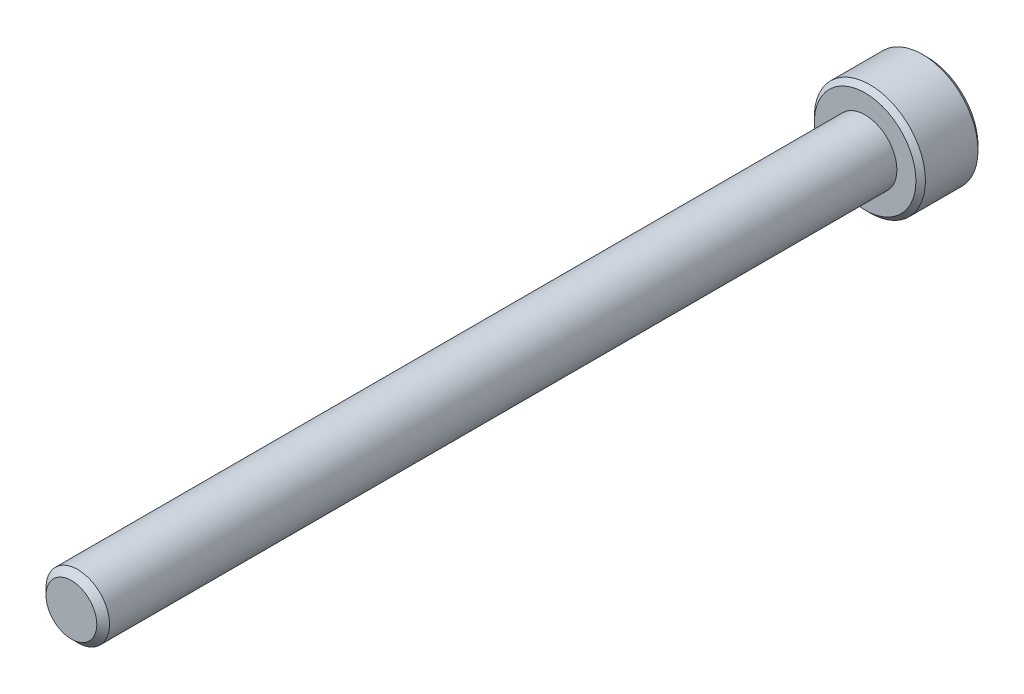
ISO-10303-21;
HEADER;
FILE_DESCRIPTION(('STEP AP214'),'2;1');
FILE_NAME('part.step','',(''),(''),'','','');
FILE_SCHEMA(('AUTOMOTIVE_DESIGN { 1 0 10303 214 1 1 1 1 }'));
ENDSEC;
DATA;
#1=APPLICATION_CONTEXT('core data for automotive mechanical design processes');
#2=APPLICATION_PROTOCOL_DEFINITION('international standard','automotive_design',2000,#1);
#3=PRODUCT_CONTEXT('',#1,'mechanical');
#4=PRODUCT('Part','Part','',(#3));
#5=PRODUCT_RELATED_PRODUCT_CATEGORY('part','',(#4));
#6=PRODUCT_DEFINITION_FORMATION('','',#4);
#7=PRODUCT_DEFINITION_CONTEXT('part definition',#1,'design');
#8=PRODUCT_DEFINITION('design','',#6,#7);
#9=PRODUCT_DEFINITION_SHAPE('','',#8);
#10=(LENGTH_UNIT() NAMED_UNIT(*) SI_UNIT(.MILLI.,.METRE.));
#11=(NAMED_UNIT(*) PLANE_ANGLE_UNIT() SI_UNIT($,.RADIAN.));
#12=(NAMED_UNIT(*) SI_UNIT($,.STERADIAN.) SOLID_ANGLE_UNIT());
#13=UNCERTAINTY_MEASURE_WITH_UNIT(LENGTH_MEASURE(1.E-05),#10,'distance_accuracy_value','');
#14=(GEOMETRIC_REPRESENTATION_CONTEXT(3) GLOBAL_UNCERTAINTY_ASSIGNED_CONTEXT((#13)) GLOBAL_UNIT_ASSIGNED_CONTEXT((#10,
#11,#12)) REPRESENTATION_CONTEXT('',''));
#15=CARTESIAN_POINT('',(0.,0.,0.));
#16=DIRECTION('',(0.,0.,1.));
#17=DIRECTION('',(1.,0.,0.));
#18=AXIS2_PLACEMENT_3D('',#15,#16,#17);
#19=CARTESIAN_POINT('',(0.,0.,3.91));
#20=DIRECTION('',(0.,0.,-1.));
#21=DIRECTION('',(-1.,0.,0.));
#22=AXIS2_PLACEMENT_3D('',#19,#20,#21);
#23=CYLINDRICAL_SURFACE('',#22,3.5);
#24=CARTESIAN_POINT('',(0.,0.,3.61000000000001));
#25=DIRECTION('',(0.,0.,1.));
#26=DIRECTION('',(1.,0.,0.));
#27=AXIS2_PLACEMENT_3D('',#24,#25,#26);
#28=CIRCLE('',#27,3.5);
#29=CARTESIAN_POINT('',(3.5,0.,3.61000000000001));
#30=VERTEX_POINT('',#29);
#31=EDGE_CURVE('E46',#30,#30,#28,.F.);
#32=ORIENTED_EDGE('',*,*,#31,.T.);
#33=EDGE_LOOP('',(#32));
#34=FACE_BOUND('',#33,.T.);
#35=CARTESIAN_POINT('',(0.,0.,0.299999999999994));
#36=DIRECTION('',(0.,0.,1.));
#37=DIRECTION('',(1.,0.,0.));
#38=AXIS2_PLACEMENT_3D('',#35,#36,#37);
#39=CIRCLE('',#38,3.5);
#40=CARTESIAN_POINT('',(3.5,0.,0.299999999999994));
#41=VERTEX_POINT('',#40);
#42=EDGE_CURVE('E157',#41,#41,#39,.T.);
#43=ORIENTED_EDGE('',*,*,#42,.T.);
#44=EDGE_LOOP('',(#43));
#45=FACE_BOUND('',#44,.T.);
#46=ADVANCED_FACE('F37',(#34,#45),#23,.T.);
#47=CARTESIAN_POINT('',(0.,0.,3.91));
#48=DIRECTION('',(0.,0.,1.));
#49=DIRECTION('',(1.,0.,0.));
#50=AXIS2_PLACEMENT_3D('',#47,#48,#49);
#51=PLANE('',#50);
#52=CARTESIAN_POINT('',(0.,0.,3.91));
#53=DIRECTION('',(0.,0.,1.));
#54=DIRECTION('',(1.,0.,0.));
#55=AXIS2_PLACEMENT_3D('',#52,#53,#54);
#56=CIRCLE('',#55,3.20000000000001);
#57=CARTESIAN_POINT('',(3.20000000000001,0.,3.91));
#58=VERTEX_POINT('',#57);
#59=EDGE_CURVE('E154',#58,#58,#56,.T.);
#60=ORIENTED_EDGE('',*,*,#59,.T.);
#61=EDGE_LOOP('',(#60));
#62=FACE_BOUND('',#61,.T.);
#63=CARTESIAN_POINT('',(0.,0.,3.91));
#64=DIRECTION('',(0.,0.,1.));
#65=DIRECTION('',(1.,0.,0.));
#66=AXIS2_PLACEMENT_3D('',#63,#64,#65);
#67=CIRCLE('',#66,2.);
#68=CARTESIAN_POINT('',(2.,0.,3.91));
#69=VERTEX_POINT('',#68);
#70=EDGE_CURVE('E140',#69,#69,#67,.T.);
#71=ORIENTED_EDGE('',*,*,#70,.F.);
#72=EDGE_LOOP('',(#71));
#73=FACE_BOUND('',#72,.T.);
#74=ADVANCED_FACE('F170',(#62,#73),#51,.T.);
#75=CARTESIAN_POINT('',(0.,0.,0.));
#76=DIRECTION('',(0.,0.,1.));
#77=DIRECTION('',(1.,0.,0.));
#78=AXIS2_PLACEMENT_3D('',#75,#76,#77);
#79=PLANE('',#78);
#80=CARTESIAN_POINT('',(0.,0.,0.));
#81=DIRECTION('',(0.,0.,1.));
#82=DIRECTION('',(1.,0.,0.));
#83=AXIS2_PLACEMENT_3D('',#80,#81,#82);
#84=CIRCLE('',#83,3.20000000000002);
#85=CARTESIAN_POINT('',(3.20000000000002,0.,0.));
#86=VERTEX_POINT('',#85);
#87=EDGE_CURVE('E11',#86,#86,#84,.F.);
#88=ORIENTED_EDGE('',*,*,#87,.T.);
#89=EDGE_LOOP('',(#88));
#90=FACE_BOUND('',#89,.T.);
#91=DIRECTION('',(0.866025403784439,-0.5,0.));
#92=VECTOR('',#91,1.);
#93=CARTESIAN_POINT('',(0.,1.76091832102836,0.));
#94=LINE('',#93,#92);
#95=CARTESIAN_POINT('',(0.,1.76091832102836,0.));
#96=VERTEX_POINT('',#95);
#97=CARTESIAN_POINT('',(1.525,0.88045916051418,0.));
#98=VERTEX_POINT('',#97);
#99=EDGE_CURVE('E127',#96,#98,#94,.T.);
#100=ORIENTED_EDGE('',*,*,#99,.F.);
#101=DIRECTION('',(0.866025403784439,0.5,0.));
#102=VECTOR('',#101,1.);
#103=CARTESIAN_POINT('',(-1.525,0.880459160514179,0.));
#104=LINE('',#103,#102);
#105=CARTESIAN_POINT('',(-1.525,0.880459160514179,0.));
#106=VERTEX_POINT('',#105);
#107=EDGE_CURVE('E53',#106,#96,#104,.T.);
#108=ORIENTED_EDGE('',*,*,#107,.F.);
#109=DIRECTION('',(0.,1.,0.));
#110=VECTOR('',#109,1.);
#111=CARTESIAN_POINT('',(-1.525,-0.88045916051418,0.));
#112=LINE('',#111,#110);
#113=CARTESIAN_POINT('',(-1.525,-0.88045916051418,0.));
#114=VERTEX_POINT('',#113);
#115=EDGE_CURVE('E136',#114,#106,#112,.T.);
#116=ORIENTED_EDGE('',*,*,#115,.F.);
#117=DIRECTION('',(-0.866025403784439,0.5,0.));
#118=VECTOR('',#117,1.);
#119=CARTESIAN_POINT('',(0.,-1.76091832102836,0.));
#120=LINE('',#119,#118);
#121=CARTESIAN_POINT('',(0.,-1.76091832102836,0.));
#122=VERTEX_POINT('',#121);
#123=EDGE_CURVE('E134',#122,#114,#120,.T.);
#124=ORIENTED_EDGE('',*,*,#123,.F.);
#125=DIRECTION('',(-0.866025403784438,-0.5,0.));
#126=VECTOR('',#125,1.);
#127=CARTESIAN_POINT('',(1.525,-0.880459160514179,0.));
#128=LINE('',#127,#126);
#129=CARTESIAN_POINT('',(1.525,-0.880459160514179,0.));
#130=VERTEX_POINT('',#129);
#131=EDGE_CURVE('E101',#130,#122,#128,.T.);
#132=ORIENTED_EDGE('',*,*,#131,.F.);
#133=DIRECTION('',(0.,-1.,0.));
#134=VECTOR('',#133,1.);
#135=CARTESIAN_POINT('',(1.525,0.88045916051418,0.));
#136=LINE('',#135,#134);
#137=EDGE_CURVE('E130',#98,#130,#136,.T.);
#138=ORIENTED_EDGE('',*,*,#137,.F.);
#139=EDGE_LOOP('',(#100,#108,#116,#124,#132,#138));
#140=FACE_BOUND('',#139,.T.);
#141=ADVANCED_FACE('F173',(#90,#140),#79,.F.);
#142=CARTESIAN_POINT('',(0.,0.,53.91));
#143=DIRECTION('',(0.,0.,-1.));
#144=DIRECTION('',(-1.,0.,0.));
#145=AXIS2_PLACEMENT_3D('',#142,#143,#144);
#146=CYLINDRICAL_SURFACE('',#145,2.);
#147=CARTESIAN_POINT('',(0.,0.,53.51));
#148=DIRECTION('',(0.,0.,1.));
#149=DIRECTION('',(1.,0.,0.));
#150=AXIS2_PLACEMENT_3D('',#147,#148,#149);
#151=CIRCLE('',#150,2.);
#152=CARTESIAN_POINT('',(2.,0.,53.51));
#153=VERTEX_POINT('',#152);
#154=EDGE_CURVE('E151',#153,#153,#151,.F.);
#155=ORIENTED_EDGE('',*,*,#154,.T.);
#156=EDGE_LOOP('',(#155));
#157=FACE_BOUND('',#156,.T.);
#158=ORIENTED_EDGE('',*,*,#70,.T.);
#159=EDGE_LOOP('',(#158));
#160=FACE_BOUND('',#159,.T.);
#161=ADVANCED_FACE('F177',(#157,#160),#146,.T.);
#162=CARTESIAN_POINT('',(0.,0.,53.91));
#163=DIRECTION('',(0.,0.,1.));
#164=DIRECTION('',(1.,0.,0.));
#165=AXIS2_PLACEMENT_3D('',#162,#163,#164);
#166=PLANE('',#165);
#167=CARTESIAN_POINT('',(0.,0.,53.91));
#168=DIRECTION('',(0.,0.,1.));
#169=DIRECTION('',(1.,0.,0.));
#170=AXIS2_PLACEMENT_3D('',#167,#168,#169);
#171=CIRCLE('',#170,1.6);
#172=CARTESIAN_POINT('',(1.6,0.,53.91));
#173=VERTEX_POINT('',#172);
#174=EDGE_CURVE('E148',#173,#173,#171,.T.);
#175=ORIENTED_EDGE('',*,*,#174,.T.);
#176=EDGE_LOOP('',(#175));
#177=FACE_BOUND('',#176,.T.);
#178=ADVANCED_FACE('F179',(#177),#166,.T.);
#179=CARTESIAN_POINT('',(-1.525,0.880459160514179,2.));
#180=DIRECTION('',(-0.5,0.866025403784439,0.));
#181=DIRECTION('',(-0.866025403784439,-0.5,0.));
#182=AXIS2_PLACEMENT_3D('',#179,#180,#181);
#183=PLANE('',#182);
#184=ORIENTED_EDGE('',*,*,#107,.T.);
#185=DIRECTION('',(0.,0.,-1.));
#186=VECTOR('',#185,1.);
#187=CARTESIAN_POINT('',(0.,1.76091832102836,2.));
#188=LINE('',#187,#186);
#189=CARTESIAN_POINT('',(0.,1.76091832102836,2.));
#190=VERTEX_POINT('',#189);
#191=EDGE_CURVE('E83',#190,#96,#188,.T.);
#192=ORIENTED_EDGE('',*,*,#191,.F.);
#193=DIRECTION('',(0.866025403784439,0.5,0.));
#194=VECTOR('',#193,1.);
#195=CARTESIAN_POINT('',(-1.525,0.880459160514179,2.));
#196=LINE('',#195,#194);
#197=CARTESIAN_POINT('',(-1.525,0.880459160514179,2.));
#198=VERTEX_POINT('',#197);
#199=EDGE_CURVE('E138',#198,#190,#196,.T.);
#200=ORIENTED_EDGE('',*,*,#199,.F.);
#201=DIRECTION('',(0.,0.,-1.));
#202=VECTOR('',#201,1.);
#203=CARTESIAN_POINT('',(-1.525,0.880459160514179,2.));
#204=LINE('',#203,#202);
#205=EDGE_CURVE('E61',#198,#106,#204,.T.);
#206=ORIENTED_EDGE('',*,*,#205,.T.);
#207=EDGE_LOOP('',(#184,#192,#200,#206));
#208=FACE_BOUND('',#207,.T.);
#209=ADVANCED_FACE('F186',(#208),#183,.F.);
#210=CARTESIAN_POINT('',(-1.525,-0.88045916051418,2.));
#211=DIRECTION('',(-1.,0.,0.));
#212=DIRECTION('',(0.,0.,1.));
#213=AXIS2_PLACEMENT_3D('',#210,#211,#212);
#214=PLANE('',#213);
#215=ORIENTED_EDGE('',*,*,#115,.T.);
#216=ORIENTED_EDGE('',*,*,#205,.F.);
#217=DIRECTION('',(0.,1.,0.));
#218=VECTOR('',#217,1.);
#219=CARTESIAN_POINT('',(-1.525,-0.88045916051418,2.));
#220=LINE('',#219,#218);
#221=CARTESIAN_POINT('',(-1.525,-0.88045916051418,2.));
#222=VERTEX_POINT('',#221);
#223=EDGE_CURVE('E113',#222,#198,#220,.T.);
#224=ORIENTED_EDGE('',*,*,#223,.F.);
#225=DIRECTION('',(0.,0.,-1.));
#226=VECTOR('',#225,1.);
#227=CARTESIAN_POINT('',(-1.525,-0.88045916051418,2.));
#228=LINE('',#227,#226);
#229=EDGE_CURVE('E105',#222,#114,#228,.T.);
#230=ORIENTED_EDGE('',*,*,#229,.T.);
#231=EDGE_LOOP('',(#215,#216,#224,#230));
#232=FACE_BOUND('',#231,.T.);
#233=ADVANCED_FACE('F221',(#232),#214,.F.);
#234=CARTESIAN_POINT('',(0.,-1.76091832102836,2.));
#235=DIRECTION('',(-0.5,-0.866025403784439,0.));
#236=DIRECTION('',(0.866025403784439,-0.5,0.));
#237=AXIS2_PLACEMENT_3D('',#234,#235,#236);
#238=PLANE('',#237);
#239=ORIENTED_EDGE('',*,*,#123,.T.);
#240=ORIENTED_EDGE('',*,*,#229,.F.);
#241=DIRECTION('',(-0.866025403784439,0.5,0.));
#242=VECTOR('',#241,1.);
#243=CARTESIAN_POINT('',(0.,-1.76091832102836,2.));
#244=LINE('',#243,#242);
#245=CARTESIAN_POINT('',(0.,-1.76091832102836,2.));
#246=VERTEX_POINT('',#245);
#247=EDGE_CURVE('E109',#246,#222,#244,.T.);
#248=ORIENTED_EDGE('',*,*,#247,.F.);
#249=DIRECTION('',(0.,0.,-1.));
#250=VECTOR('',#249,1.);
#251=CARTESIAN_POINT('',(0.,-1.76091832102836,2.));
#252=LINE('',#251,#250);
#253=EDGE_CURVE('E94',#246,#122,#252,.T.);
#254=ORIENTED_EDGE('',*,*,#253,.T.);
#255=EDGE_LOOP('',(#239,#240,#248,#254));
#256=FACE_BOUND('',#255,.T.);
#257=ADVANCED_FACE('F110',(#256),#238,.F.);
#258=CARTESIAN_POINT('',(1.525,-0.880459160514179,2.));
#259=DIRECTION('',(0.5,-0.866025403784439,0.));
#260=DIRECTION('',(0.866025403784438,0.5,0.));
#261=AXIS2_PLACEMENT_3D('',#258,#259,#260);
#262=PLANE('',#261);
#263=ORIENTED_EDGE('',*,*,#131,.T.);
#264=ORIENTED_EDGE('',*,*,#253,.F.);
#265=DIRECTION('',(-0.866025403784438,-0.5,0.));
#266=VECTOR('',#265,1.);
#267=CARTESIAN_POINT('',(1.525,-0.880459160514179,2.));
#268=LINE('',#267,#266);
#269=CARTESIAN_POINT('',(1.525,-0.880459160514179,2.));
#270=VERTEX_POINT('',#269);
#271=EDGE_CURVE('E98',#270,#246,#268,.T.);
#272=ORIENTED_EDGE('',*,*,#271,.F.);
#273=DIRECTION('',(0.,0.,-1.));
#274=VECTOR('',#273,1.);
#275=CARTESIAN_POINT('',(1.525,-0.880459160514179,2.));
#276=LINE('',#275,#274);
#277=EDGE_CURVE('E106',#270,#130,#276,.T.);
#278=ORIENTED_EDGE('',*,*,#277,.T.);
#279=EDGE_LOOP('',(#263,#264,#272,#278));
#280=FACE_BOUND('',#279,.T.);
#281=ADVANCED_FACE('F96',(#280),#262,.F.);
#282=CARTESIAN_POINT('',(1.525,0.88045916051418,2.));
#283=DIRECTION('',(1.,0.,0.));
#284=DIRECTION('',(0.,0.,-1.));
#285=AXIS2_PLACEMENT_3D('',#282,#283,#284);
#286=PLANE('',#285);
#287=ORIENTED_EDGE('',*,*,#137,.T.);
#288=ORIENTED_EDGE('',*,*,#277,.F.);
#289=DIRECTION('',(0.,-1.,0.));
#290=VECTOR('',#289,1.);
#291=CARTESIAN_POINT('',(1.525,0.88045916051418,2.));
#292=LINE('',#291,#290);
#293=CARTESIAN_POINT('',(1.525,0.88045916051418,2.));
#294=VERTEX_POINT('',#293);
#295=EDGE_CURVE('E119',#294,#270,#292,.T.);
#296=ORIENTED_EDGE('',*,*,#295,.F.);
#297=DIRECTION('',(0.,0.,-1.));
#298=VECTOR('',#297,1.);
#299=CARTESIAN_POINT('',(1.525,0.88045916051418,2.));
#300=LINE('',#299,#298);
#301=EDGE_CURVE('E143',#294,#98,#300,.T.);
#302=ORIENTED_EDGE('',*,*,#301,.T.);
#303=EDGE_LOOP('',(#287,#288,#296,#302));
#304=FACE_BOUND('',#303,.T.);
#305=ADVANCED_FACE('F217',(#304),#286,.F.);
#306=CARTESIAN_POINT('',(0.,1.76091832102836,2.));
#307=DIRECTION('',(0.5,0.866025403784439,0.));
#308=DIRECTION('',(-0.866025403784439,0.5,0.));
#309=AXIS2_PLACEMENT_3D('',#306,#307,#308);
#310=PLANE('',#309);
#311=ORIENTED_EDGE('',*,*,#99,.T.);
#312=ORIENTED_EDGE('',*,*,#301,.F.);
#313=DIRECTION('',(0.866025403784439,-0.5,0.));
#314=VECTOR('',#313,1.);
#315=CARTESIAN_POINT('',(0.,1.76091832102836,2.));
#316=LINE('',#315,#314);
#317=EDGE_CURVE('E121',#190,#294,#316,.T.);
#318=ORIENTED_EDGE('',*,*,#317,.F.);
#319=ORIENTED_EDGE('',*,*,#191,.T.);
#320=EDGE_LOOP('',(#311,#312,#318,#319));
#321=FACE_BOUND('',#320,.T.);
#322=ADVANCED_FACE('F209',(#321),#310,.F.);
#323=CARTESIAN_POINT('',(0.,0.,2.));
#324=DIRECTION('',(0.,0.,-1.));
#325=DIRECTION('',(-1.,0.,0.));
#326=AXIS2_PLACEMENT_3D('',#323,#324,#325);
#327=PLANE('',#326);
#328=ORIENTED_EDGE('',*,*,#199,.T.);
#329=ORIENTED_EDGE('',*,*,#317,.T.);
#330=ORIENTED_EDGE('',*,*,#295,.T.);
#331=ORIENTED_EDGE('',*,*,#271,.T.);
#332=ORIENTED_EDGE('',*,*,#247,.T.);
#333=ORIENTED_EDGE('',*,*,#223,.T.);
#334=EDGE_LOOP('',(#328,#329,#330,#331,#332,#333));
#335=FACE_BOUND('',#334,.T.);
#336=ADVANCED_FACE('F116',(#335),#327,.T.);
#337=CARTESIAN_POINT('',(0.,0.,53.91));
#338=DIRECTION('',(0.,0.,-1.));
#339=DIRECTION('',(-1.,0.,0.));
#340=AXIS2_PLACEMENT_3D('',#337,#338,#339);
#341=CONICAL_SURFACE('',#340,1.6,0.785398163397446);
#342=ORIENTED_EDGE('',*,*,#154,.F.);
#343=EDGE_LOOP('',(#342));
#344=FACE_BOUND('',#343,.T.);
#345=ORIENTED_EDGE('',*,*,#174,.F.);
#346=EDGE_LOOP('',(#345));
#347=FACE_BOUND('',#346,.T.);
#348=ADVANCED_FACE('F167',(#344,#347),#341,.T.);
#349=CARTESIAN_POINT('',(0.,0.,3.91));
#350=DIRECTION('',(0.,0.,-1.));
#351=DIRECTION('',(-1.,0.,0.));
#352=AXIS2_PLACEMENT_3D('',#349,#350,#351);
#353=CONICAL_SURFACE('',#352,3.20000000000001,0.785398163397447);
#354=ORIENTED_EDGE('',*,*,#31,.F.);
#355=EDGE_LOOP('',(#354));
#356=FACE_BOUND('',#355,.T.);
#357=ORIENTED_EDGE('',*,*,#59,.F.);
#358=EDGE_LOOP('',(#357));
#359=FACE_BOUND('',#358,.T.);
#360=ADVANCED_FACE('F164',(#356,#359),#353,.T.);
#361=CARTESIAN_POINT('',(0.,0.,0.299999999999994));
#362=DIRECTION('',(0.,0.,1.));
#363=DIRECTION('',(1.,0.,0.));
#364=AXIS2_PLACEMENT_3D('',#361,#362,#363);
#365=CONICAL_SURFACE('',#364,3.5,0.785398163397434);
#366=ORIENTED_EDGE('',*,*,#87,.F.);
#367=EDGE_LOOP('',(#366));
#368=FACE_BOUND('',#367,.T.);
#369=ORIENTED_EDGE('',*,*,#42,.F.);
#370=EDGE_LOOP('',(#369));
#371=FACE_BOUND('',#370,.T.);
#372=ADVANCED_FACE('F40',(#368,#371),#365,.T.);
#373=CLOSED_SHELL('',(#46,#74,#141,#161,#178,#209,#233,#257,#281,#305,#322,#336,#348,#360,#372));
#374=MANIFOLD_SOLID_BREP('B2',#373);
#375=ADVANCED_BREP_SHAPE_REPRESENTATION('',(#18,#374),#14);
#376=SHAPE_DEFINITION_REPRESENTATION(#9,#375);
ENDSEC;
END-ISO-10303-21;
